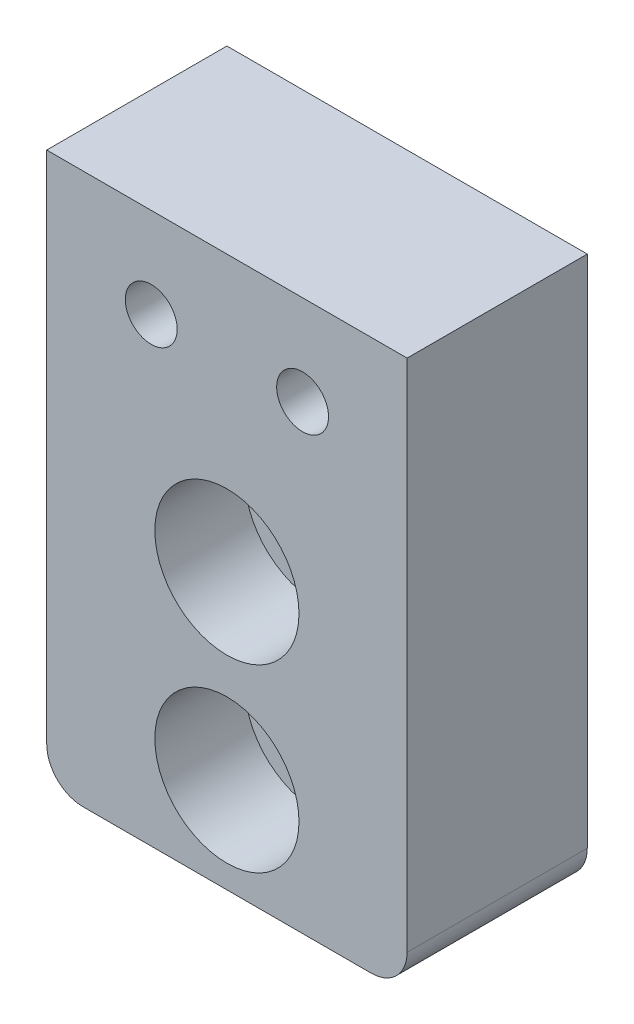
ISO-10303-21;
HEADER;
FILE_DESCRIPTION(('STEP AP214'),'2;1');
FILE_NAME('part.step','',(''),(''),'','','');
FILE_SCHEMA(('AUTOMOTIVE_DESIGN { 1 0 10303 214 1 1 1 1 }'));
ENDSEC;
DATA;
#1=APPLICATION_CONTEXT('core data for automotive mechanical design processes');
#2=APPLICATION_PROTOCOL_DEFINITION('international standard','automotive_design',2000,#1);
#3=PRODUCT_CONTEXT('',#1,'mechanical');
#4=PRODUCT('Part','Part','',(#3));
#5=PRODUCT_RELATED_PRODUCT_CATEGORY('part','',(#4));
#6=PRODUCT_DEFINITION_FORMATION('','',#4);
#7=PRODUCT_DEFINITION_CONTEXT('part definition',#1,'design');
#8=PRODUCT_DEFINITION('design','',#6,#7);
#9=PRODUCT_DEFINITION_SHAPE('','',#8);
#10=(LENGTH_UNIT() NAMED_UNIT(*) SI_UNIT(.MILLI.,.METRE.));
#11=(NAMED_UNIT(*) PLANE_ANGLE_UNIT() SI_UNIT($,.RADIAN.));
#12=(NAMED_UNIT(*) SI_UNIT($,.STERADIAN.) SOLID_ANGLE_UNIT());
#13=UNCERTAINTY_MEASURE_WITH_UNIT(LENGTH_MEASURE(1.E-05),#10,'distance_accuracy_value','');
#14=(GEOMETRIC_REPRESENTATION_CONTEXT(3) GLOBAL_UNCERTAINTY_ASSIGNED_CONTEXT((#13)) GLOBAL_UNIT_ASSIGNED_CONTEXT((#10,
#11,#12)) REPRESENTATION_CONTEXT('',''));
#15=CARTESIAN_POINT('',(0.,0.,0.));
#16=DIRECTION('',(0.,0.,1.));
#17=DIRECTION('',(1.,0.,0.));
#18=AXIS2_PLACEMENT_3D('',#15,#16,#17);
#19=CARTESIAN_POINT('',(0.,0.,12.7));
#20=DIRECTION('',(1.,0.,0.));
#21=DIRECTION('',(0.,0.,-1.));
#22=AXIS2_PLACEMENT_3D('',#19,#20,#21);
#23=PLANE('',#22);
#24=DIRECTION('',(0.,-1.,0.));
#25=VECTOR('',#24,1.);
#26=CARTESIAN_POINT('',(0.,0.,0.));
#27=LINE('',#26,#25);
#28=CARTESIAN_POINT('',(0.,38.8112,0.));
#29=VERTEX_POINT('',#28);
#30=CARTESIAN_POINT('',(0.,2.54,0.));
#31=VERTEX_POINT('',#30);
#32=EDGE_CURVE('E116',#29,#31,#27,.T.);
#33=ORIENTED_EDGE('',*,*,#32,.T.);
#34=DIRECTION('',(0.,0.,-1.));
#35=VECTOR('',#34,1.);
#36=CARTESIAN_POINT('',(0.,2.54,12.7));
#37=LINE('',#36,#35);
#38=CARTESIAN_POINT('',(0.,2.54,12.7));
#39=VERTEX_POINT('',#38);
#40=EDGE_CURVE('E11',#31,#39,#37,.F.);
#41=ORIENTED_EDGE('',*,*,#40,.T.);
#42=DIRECTION('',(0.,-1.,0.));
#43=VECTOR('',#42,1.);
#44=CARTESIAN_POINT('',(0.,0.,12.7));
#45=LINE('',#44,#43);
#46=CARTESIAN_POINT('',(0.,38.8112,12.7));
#47=VERTEX_POINT('',#46);
#48=EDGE_CURVE('E123',#47,#39,#45,.T.);
#49=ORIENTED_EDGE('',*,*,#48,.F.);
#50=DIRECTION('',(0.,0.,-1.));
#51=VECTOR('',#50,1.);
#52=CARTESIAN_POINT('',(0.,38.8112,12.7));
#53=LINE('',#52,#51);
#54=EDGE_CURVE('E108',#47,#29,#53,.T.);
#55=ORIENTED_EDGE('',*,*,#54,.T.);
#56=EDGE_LOOP('',(#33,#41,#49,#55));
#57=FACE_BOUND('',#56,.T.);
#58=ADVANCED_FACE('F34',(#57),#23,.F.);
#59=CARTESIAN_POINT('',(0.,0.,12.7));
#60=DIRECTION('',(0.,1.,0.));
#61=DIRECTION('',(0.,0.,1.));
#62=AXIS2_PLACEMENT_3D('',#59,#60,#61);
#63=PLANE('',#62);
#64=DIRECTION('',(1.,0.,0.));
#65=VECTOR('',#64,1.);
#66=CARTESIAN_POINT('',(0.,0.,0.));
#67=LINE('',#66,#65);
#68=CARTESIAN_POINT('',(2.54,0.,0.));
#69=VERTEX_POINT('',#68);
#70=CARTESIAN_POINT('',(22.86,0.,0.));
#71=VERTEX_POINT('',#70);
#72=EDGE_CURVE('E118',#69,#71,#67,.T.);
#73=ORIENTED_EDGE('',*,*,#72,.T.);
#74=DIRECTION('',(0.,0.,-1.));
#75=VECTOR('',#74,1.);
#76=CARTESIAN_POINT('',(22.86,0.,12.7));
#77=LINE('',#76,#75);
#78=CARTESIAN_POINT('',(22.86,0.,12.7));
#79=VERTEX_POINT('',#78);
#80=EDGE_CURVE('E55',#71,#79,#77,.F.);
#81=ORIENTED_EDGE('',*,*,#80,.T.);
#82=DIRECTION('',(1.,0.,0.));
#83=VECTOR('',#82,1.);
#84=CARTESIAN_POINT('',(0.,0.,12.7));
#85=LINE('',#84,#83);
#86=CARTESIAN_POINT('',(2.54,0.,12.7));
#87=VERTEX_POINT('',#86);
#88=EDGE_CURVE('E98',#87,#79,#85,.T.);
#89=ORIENTED_EDGE('',*,*,#88,.F.);
#90=DIRECTION('',(0.,0.,-1.));
#91=VECTOR('',#90,1.);
#92=CARTESIAN_POINT('',(2.54,0.,12.7));
#93=LINE('',#92,#91);
#94=EDGE_CURVE('E130',#87,#69,#93,.T.);
#95=ORIENTED_EDGE('',*,*,#94,.T.);
#96=EDGE_LOOP('',(#73,#81,#89,#95));
#97=FACE_BOUND('',#96,.T.);
#98=ADVANCED_FACE('F138',(#97),#63,.F.);
#99=CARTESIAN_POINT('',(25.4,0.,12.7));
#100=DIRECTION('',(-1.,0.,0.));
#101=DIRECTION('',(0.,0.,1.));
#102=AXIS2_PLACEMENT_3D('',#99,#100,#101);
#103=PLANE('',#102);
#104=DIRECTION('',(0.,1.,0.));
#105=VECTOR('',#104,1.);
#106=CARTESIAN_POINT('',(25.4,0.,12.7));
#107=LINE('',#106,#105);
#108=CARTESIAN_POINT('',(25.4,2.54,12.7));
#109=VERTEX_POINT('',#108);
#110=CARTESIAN_POINT('',(25.4,38.8112,12.7));
#111=VERTEX_POINT('',#110);
#112=EDGE_CURVE('E88',#109,#111,#107,.T.);
#113=ORIENTED_EDGE('',*,*,#112,.F.);
#114=DIRECTION('',(0.,0.,-1.));
#115=VECTOR('',#114,1.);
#116=CARTESIAN_POINT('',(25.4,2.54,12.7));
#117=LINE('',#116,#115);
#118=CARTESIAN_POINT('',(25.4,2.54,0.));
#119=VERTEX_POINT('',#118);
#120=EDGE_CURVE('E107',#109,#119,#117,.T.);
#121=ORIENTED_EDGE('',*,*,#120,.T.);
#122=DIRECTION('',(0.,1.,0.));
#123=VECTOR('',#122,1.);
#124=CARTESIAN_POINT('',(25.4,0.,0.));
#125=LINE('',#124,#123);
#126=CARTESIAN_POINT('',(25.4,38.8112,0.));
#127=VERTEX_POINT('',#126);
#128=EDGE_CURVE('E104',#119,#127,#125,.T.);
#129=ORIENTED_EDGE('',*,*,#128,.T.);
#130=DIRECTION('',(0.,0.,-1.));
#131=VECTOR('',#130,1.);
#132=CARTESIAN_POINT('',(25.4,38.8112,12.7));
#133=LINE('',#132,#131);
#134=EDGE_CURVE('E101',#111,#127,#133,.T.);
#135=ORIENTED_EDGE('',*,*,#134,.F.);
#136=EDGE_LOOP('',(#113,#121,#129,#135));
#137=FACE_BOUND('',#136,.T.);
#138=ADVANCED_FACE('F102',(#137),#103,.F.);
#139=CARTESIAN_POINT('',(0.,38.8112,12.7));
#140=DIRECTION('',(0.,-1.,0.));
#141=DIRECTION('',(0.,0.,-1.));
#142=AXIS2_PLACEMENT_3D('',#139,#140,#141);
#143=PLANE('',#142);
#144=DIRECTION('',(-1.,0.,0.));
#145=VECTOR('',#144,1.);
#146=CARTESIAN_POINT('',(0.,38.8112,0.));
#147=LINE('',#146,#145);
#148=EDGE_CURVE('E122',#127,#29,#147,.T.);
#149=ORIENTED_EDGE('',*,*,#148,.T.);
#150=ORIENTED_EDGE('',*,*,#54,.F.);
#151=DIRECTION('',(-1.,0.,0.));
#152=VECTOR('',#151,1.);
#153=CARTESIAN_POINT('',(0.,38.8112,12.7));
#154=LINE('',#153,#152);
#155=EDGE_CURVE('E92',#111,#47,#154,.T.);
#156=ORIENTED_EDGE('',*,*,#155,.F.);
#157=ORIENTED_EDGE('',*,*,#134,.T.);
#158=EDGE_LOOP('',(#149,#150,#156,#157));
#159=FACE_BOUND('',#158,.T.);
#160=ADVANCED_FACE('F110',(#159),#143,.F.);
#161=CARTESIAN_POINT('',(0.,0.,12.7));
#162=DIRECTION('',(0.,0.,-1.));
#163=DIRECTION('',(-1.,0.,0.));
#164=AXIS2_PLACEMENT_3D('',#161,#162,#163);
#165=PLANE('',#164);
#166=CARTESIAN_POINT('',(18.034,32.4612,12.7));
#167=DIRECTION('',(0.,0.,-1.));
#168=DIRECTION('',(-1.,0.,0.));
#169=AXIS2_PLACEMENT_3D('',#166,#167,#168);
#170=CIRCLE('',#169,1.8288);
#171=CARTESIAN_POINT('',(16.2052,32.4612,12.7));
#172=VERTEX_POINT('',#171);
#173=EDGE_CURVE('E180',#172,#172,#170,.T.);
#174=ORIENTED_EDGE('',*,*,#173,.T.);
#175=EDGE_LOOP('',(#174));
#176=FACE_BOUND('',#175,.T.);
#177=CARTESIAN_POINT('',(7.366,32.4612,12.7));
#178=DIRECTION('',(0.,0.,-1.));
#179=DIRECTION('',(-1.,0.,0.));
#180=AXIS2_PLACEMENT_3D('',#177,#178,#179);
#181=CIRCLE('',#180,1.8288);
#182=CARTESIAN_POINT('',(5.5372,32.4612,12.7));
#183=VERTEX_POINT('',#182);
#184=EDGE_CURVE('E168',#183,#183,#181,.T.);
#185=ORIENTED_EDGE('',*,*,#184,.T.);
#186=EDGE_LOOP('',(#185));
#187=FACE_BOUND('',#186,.T.);
#188=CARTESIAN_POINT('',(12.7,19.4056,12.7));
#189=DIRECTION('',(0.,0.,1.));
#190=DIRECTION('',(1.,0.,0.));
#191=AXIS2_PLACEMENT_3D('',#188,#189,#190);
#192=CIRCLE('',#191,5.08);
#193=CARTESIAN_POINT('',(17.78,19.4056,12.7));
#194=VERTEX_POINT('',#193);
#195=EDGE_CURVE('E165',#194,#194,#192,.T.);
#196=ORIENTED_EDGE('',*,*,#195,.F.);
#197=EDGE_LOOP('',(#196));
#198=FACE_BOUND('',#197,.T.);
#199=CARTESIAN_POINT('',(12.7,6.7056,12.7));
#200=DIRECTION('',(0.,0.,1.));
#201=DIRECTION('',(1.,0.,0.));
#202=AXIS2_PLACEMENT_3D('',#199,#200,#201);
#203=CIRCLE('',#202,5.08);
#204=CARTESIAN_POINT('',(17.78,6.7056,12.7));
#205=VERTEX_POINT('',#204);
#206=EDGE_CURVE('E153',#205,#205,#203,.T.);
#207=ORIENTED_EDGE('',*,*,#206,.F.);
#208=EDGE_LOOP('',(#207));
#209=FACE_BOUND('',#208,.T.);
#210=ORIENTED_EDGE('',*,*,#88,.T.);
#211=CARTESIAN_POINT('',(22.86,2.54,12.7));
#212=DIRECTION('',(0.,0.,-1.));
#213=DIRECTION('',(-1.,0.,0.));
#214=AXIS2_PLACEMENT_3D('',#211,#212,#213);
#215=CIRCLE('',#214,2.54);
#216=EDGE_CURVE('E42',#79,#109,#215,.F.);
#217=ORIENTED_EDGE('',*,*,#216,.T.);
#218=ORIENTED_EDGE('',*,*,#112,.T.);
#219=ORIENTED_EDGE('',*,*,#155,.T.);
#220=ORIENTED_EDGE('',*,*,#48,.T.);
#221=CARTESIAN_POINT('',(2.54,2.54,12.7));
#222=DIRECTION('',(0.,0.,-1.));
#223=DIRECTION('',(-1.,0.,0.));
#224=AXIS2_PLACEMENT_3D('',#221,#222,#223);
#225=CIRCLE('',#224,2.54);
#226=EDGE_CURVE('E134',#39,#87,#225,.F.);
#227=ORIENTED_EDGE('',*,*,#226,.T.);
#228=EDGE_LOOP('',(#210,#217,#218,#219,#220,#227));
#229=FACE_BOUND('',#228,.T.);
#230=ADVANCED_FACE('F90',(#176,#187,#198,#209,#229),#165,.F.);
#231=CARTESIAN_POINT('',(0.,0.,0.));
#232=DIRECTION('',(0.,0.,-1.));
#233=DIRECTION('',(-1.,0.,0.));
#234=AXIS2_PLACEMENT_3D('',#231,#232,#233);
#235=PLANE('',#234);
#236=CARTESIAN_POINT('',(18.034,32.4612,0.));
#237=DIRECTION('',(0.,0.,-1.));
#238=DIRECTION('',(-1.,0.,0.));
#239=AXIS2_PLACEMENT_3D('',#236,#237,#238);
#240=CIRCLE('',#239,3.048);
#241=CARTESIAN_POINT('',(14.986,32.4612,0.));
#242=VERTEX_POINT('',#241);
#243=EDGE_CURVE('E189',#242,#242,#240,.T.);
#244=ORIENTED_EDGE('',*,*,#243,.F.);
#245=EDGE_LOOP('',(#244));
#246=FACE_BOUND('',#245,.T.);
#247=CARTESIAN_POINT('',(7.366,32.4612,0.));
#248=DIRECTION('',(0.,0.,-1.));
#249=DIRECTION('',(-1.,0.,0.));
#250=AXIS2_PLACEMENT_3D('',#247,#248,#249);
#251=CIRCLE('',#250,3.048);
#252=CARTESIAN_POINT('',(4.318,32.4612,0.));
#253=VERTEX_POINT('',#252);
#254=EDGE_CURVE('E177',#253,#253,#251,.T.);
#255=ORIENTED_EDGE('',*,*,#254,.F.);
#256=EDGE_LOOP('',(#255));
#257=FACE_BOUND('',#256,.T.);
#258=CARTESIAN_POINT('',(12.7,19.4056,0.));
#259=DIRECTION('',(0.,0.,1.));
#260=DIRECTION('',(1.,0.,0.));
#261=AXIS2_PLACEMENT_3D('',#258,#259,#260);
#262=CIRCLE('',#261,3.2639);
#263=CARTESIAN_POINT('',(15.9639,19.4056,0.));
#264=VERTEX_POINT('',#263);
#265=EDGE_CURVE('E156',#264,#264,#262,.T.);
#266=ORIENTED_EDGE('',*,*,#265,.T.);
#267=EDGE_LOOP('',(#266));
#268=FACE_BOUND('',#267,.T.);
#269=CARTESIAN_POINT('',(12.7,6.7056,0.));
#270=DIRECTION('',(0.,0.,1.));
#271=DIRECTION('',(1.,0.,0.));
#272=AXIS2_PLACEMENT_3D('',#269,#270,#271);
#273=CIRCLE('',#272,3.2639);
#274=CARTESIAN_POINT('',(15.9639,6.7056,0.));
#275=VERTEX_POINT('',#274);
#276=EDGE_CURVE('E119',#275,#275,#273,.T.);
#277=ORIENTED_EDGE('',*,*,#276,.T.);
#278=EDGE_LOOP('',(#277));
#279=FACE_BOUND('',#278,.T.);
#280=ORIENTED_EDGE('',*,*,#128,.F.);
#281=CARTESIAN_POINT('',(22.86,2.54,0.));
#282=DIRECTION('',(0.,0.,-1.));
#283=DIRECTION('',(-1.,0.,0.));
#284=AXIS2_PLACEMENT_3D('',#281,#282,#283);
#285=CIRCLE('',#284,2.54);
#286=EDGE_CURVE('E128',#119,#71,#285,.T.);
#287=ORIENTED_EDGE('',*,*,#286,.T.);
#288=ORIENTED_EDGE('',*,*,#72,.F.);
#289=CARTESIAN_POINT('',(2.54,2.54,0.));
#290=DIRECTION('',(0.,0.,-1.));
#291=DIRECTION('',(-1.,0.,0.));
#292=AXIS2_PLACEMENT_3D('',#289,#290,#291);
#293=CIRCLE('',#292,2.54);
#294=EDGE_CURVE('E126',#69,#31,#293,.T.);
#295=ORIENTED_EDGE('',*,*,#294,.T.);
#296=ORIENTED_EDGE('',*,*,#32,.F.);
#297=ORIENTED_EDGE('',*,*,#148,.F.);
#298=EDGE_LOOP('',(#280,#287,#288,#295,#296,#297));
#299=FACE_BOUND('',#298,.T.);
#300=ADVANCED_FACE('F142',(#246,#257,#268,#279,#299),#235,.T.);
#301=CARTESIAN_POINT('',(12.7,6.7056,12.7));
#302=DIRECTION('',(0.,0.,1.));
#303=DIRECTION('',(1.,0.,0.));
#304=AXIS2_PLACEMENT_3D('',#301,#302,#303);
#305=CYLINDRICAL_SURFACE('',#304,3.2639);
#306=ORIENTED_EDGE('',*,*,#276,.F.);
#307=EDGE_LOOP('',(#306));
#308=FACE_BOUND('',#307,.T.);
#309=CARTESIAN_POINT('',(12.7,6.7056,6.35));
#310=DIRECTION('',(0.,0.,1.));
#311=DIRECTION('',(1.,0.,0.));
#312=AXIS2_PLACEMENT_3D('',#309,#310,#311);
#313=CIRCLE('',#312,3.2639);
#314=CARTESIAN_POINT('',(15.9639,6.7056,6.35));
#315=VERTEX_POINT('',#314);
#316=EDGE_CURVE('E147',#315,#315,#313,.T.);
#317=ORIENTED_EDGE('',*,*,#316,.T.);
#318=EDGE_LOOP('',(#317));
#319=FACE_BOUND('',#318,.T.);
#320=ADVANCED_FACE('F197',(#308,#319),#305,.F.);
#321=CARTESIAN_POINT('',(15.9639,6.7056,6.35));
#322=DIRECTION('',(0.,0.,-1.));
#323=DIRECTION('',(-1.,0.,0.));
#324=AXIS2_PLACEMENT_3D('',#321,#322,#323);
#325=PLANE('',#324);
#326=ORIENTED_EDGE('',*,*,#316,.F.);
#327=EDGE_LOOP('',(#326));
#328=FACE_BOUND('',#327,.T.);
#329=CARTESIAN_POINT('',(12.7,6.7056,6.35));
#330=DIRECTION('',(0.,0.,1.));
#331=DIRECTION('',(1.,0.,0.));
#332=AXIS2_PLACEMENT_3D('',#329,#330,#331);
#333=CIRCLE('',#332,5.08);
#334=CARTESIAN_POINT('',(17.78,6.7056,6.35));
#335=VERTEX_POINT('',#334);
#336=EDGE_CURVE('E150',#335,#335,#333,.T.);
#337=ORIENTED_EDGE('',*,*,#336,.T.);
#338=EDGE_LOOP('',(#337));
#339=FACE_BOUND('',#338,.T.);
#340=ADVANCED_FACE('F207',(#328,#339),#325,.F.);
#341=CARTESIAN_POINT('',(12.7,6.7056,12.7));
#342=DIRECTION('',(0.,0.,1.));
#343=DIRECTION('',(1.,0.,0.));
#344=AXIS2_PLACEMENT_3D('',#341,#342,#343);
#345=CYLINDRICAL_SURFACE('',#344,5.08);
#346=ORIENTED_EDGE('',*,*,#336,.F.);
#347=EDGE_LOOP('',(#346));
#348=FACE_BOUND('',#347,.T.);
#349=ORIENTED_EDGE('',*,*,#206,.T.);
#350=EDGE_LOOP('',(#349));
#351=FACE_BOUND('',#350,.T.);
#352=ADVANCED_FACE('F213',(#348,#351),#345,.F.);
#353=CARTESIAN_POINT('',(12.7,19.4056,12.7));
#354=DIRECTION('',(0.,0.,1.));
#355=DIRECTION('',(1.,0.,0.));
#356=AXIS2_PLACEMENT_3D('',#353,#354,#355);
#357=CYLINDRICAL_SURFACE('',#356,3.2639);
#358=ORIENTED_EDGE('',*,*,#265,.F.);
#359=EDGE_LOOP('',(#358));
#360=FACE_BOUND('',#359,.T.);
#361=CARTESIAN_POINT('',(12.7,19.4056,6.35));
#362=DIRECTION('',(0.,0.,1.));
#363=DIRECTION('',(1.,0.,0.));
#364=AXIS2_PLACEMENT_3D('',#361,#362,#363);
#365=CIRCLE('',#364,3.2639);
#366=CARTESIAN_POINT('',(15.9639,19.4056,6.35));
#367=VERTEX_POINT('',#366);
#368=EDGE_CURVE('E159',#367,#367,#365,.T.);
#369=ORIENTED_EDGE('',*,*,#368,.T.);
#370=EDGE_LOOP('',(#369));
#371=FACE_BOUND('',#370,.T.);
#372=ADVANCED_FACE('F219',(#360,#371),#357,.F.);
#373=CARTESIAN_POINT('',(15.9639,19.4056,6.35));
#374=DIRECTION('',(0.,0.,-1.));
#375=DIRECTION('',(-1.,0.,0.));
#376=AXIS2_PLACEMENT_3D('',#373,#374,#375);
#377=PLANE('',#376);
#378=ORIENTED_EDGE('',*,*,#368,.F.);
#379=EDGE_LOOP('',(#378));
#380=FACE_BOUND('',#379,.T.);
#381=CARTESIAN_POINT('',(12.7,19.4056,6.35));
#382=DIRECTION('',(0.,0.,1.));
#383=DIRECTION('',(1.,0.,0.));
#384=AXIS2_PLACEMENT_3D('',#381,#382,#383);
#385=CIRCLE('',#384,5.08);
#386=CARTESIAN_POINT('',(17.78,19.4056,6.35));
#387=VERTEX_POINT('',#386);
#388=EDGE_CURVE('E162',#387,#387,#385,.T.);
#389=ORIENTED_EDGE('',*,*,#388,.T.);
#390=EDGE_LOOP('',(#389));
#391=FACE_BOUND('',#390,.T.);
#392=ADVANCED_FACE('F248',(#380,#391),#377,.F.);
#393=CARTESIAN_POINT('',(12.7,19.4056,12.7));
#394=DIRECTION('',(0.,0.,1.));
#395=DIRECTION('',(1.,0.,0.));
#396=AXIS2_PLACEMENT_3D('',#393,#394,#395);
#397=CYLINDRICAL_SURFACE('',#396,5.08);
#398=ORIENTED_EDGE('',*,*,#388,.F.);
#399=EDGE_LOOP('',(#398));
#400=FACE_BOUND('',#399,.T.);
#401=ORIENTED_EDGE('',*,*,#195,.T.);
#402=EDGE_LOOP('',(#401));
#403=FACE_BOUND('',#402,.T.);
#404=ADVANCED_FACE('F241',(#400,#403),#397,.F.);
#405=CARTESIAN_POINT('',(22.86,2.54,12.7));
#406=DIRECTION('',(0.,0.,-1.));
#407=DIRECTION('',(-1.,0.,0.));
#408=AXIS2_PLACEMENT_3D('',#405,#406,#407);
#409=CYLINDRICAL_SURFACE('',#408,2.54);
#410=ORIENTED_EDGE('',*,*,#216,.F.);
#411=ORIENTED_EDGE('',*,*,#80,.F.);
#412=ORIENTED_EDGE('',*,*,#286,.F.);
#413=ORIENTED_EDGE('',*,*,#120,.F.);
#414=EDGE_LOOP('',(#410,#411,#412,#413));
#415=FACE_BOUND('',#414,.T.);
#416=ADVANCED_FACE('F239',(#415),#409,.T.);
#417=CARTESIAN_POINT('',(2.54,2.54,12.7));
#418=DIRECTION('',(0.,0.,-1.));
#419=DIRECTION('',(-1.,0.,0.));
#420=AXIS2_PLACEMENT_3D('',#417,#418,#419);
#421=CYLINDRICAL_SURFACE('',#420,2.54);
#422=ORIENTED_EDGE('',*,*,#226,.F.);
#423=ORIENTED_EDGE('',*,*,#40,.F.);
#424=ORIENTED_EDGE('',*,*,#294,.F.);
#425=ORIENTED_EDGE('',*,*,#94,.F.);
#426=EDGE_LOOP('',(#422,#423,#424,#425));
#427=FACE_BOUND('',#426,.T.);
#428=ADVANCED_FACE('F36',(#427),#421,.T.);
#429=CARTESIAN_POINT('',(7.366,32.4612,0.));
#430=DIRECTION('',(0.,0.,-1.));
#431=DIRECTION('',(-1.,0.,0.));
#432=AXIS2_PLACEMENT_3D('',#429,#430,#431);
#433=CYLINDRICAL_SURFACE('',#432,1.8288);
#434=ORIENTED_EDGE('',*,*,#184,.F.);
#435=EDGE_LOOP('',(#434));
#436=FACE_BOUND('',#435,.T.);
#437=CARTESIAN_POINT('',(7.366,32.4612,3.556));
#438=DIRECTION('',(0.,0.,-1.));
#439=DIRECTION('',(-1.,0.,0.));
#440=AXIS2_PLACEMENT_3D('',#437,#438,#439);
#441=CIRCLE('',#440,1.8288);
#442=CARTESIAN_POINT('',(5.5372,32.4612,3.556));
#443=VERTEX_POINT('',#442);
#444=EDGE_CURVE('E171',#443,#443,#441,.T.);
#445=ORIENTED_EDGE('',*,*,#444,.T.);
#446=EDGE_LOOP('',(#445));
#447=FACE_BOUND('',#446,.T.);
#448=ADVANCED_FACE('F247',(#436,#447),#433,.F.);
#449=CARTESIAN_POINT('',(9.1948,32.4612,3.556));
#450=DIRECTION('',(0.,0.,1.));
#451=DIRECTION('',(1.,0.,0.));
#452=AXIS2_PLACEMENT_3D('',#449,#450,#451);
#453=PLANE('',#452);
#454=ORIENTED_EDGE('',*,*,#444,.F.);
#455=EDGE_LOOP('',(#454));
#456=FACE_BOUND('',#455,.T.);
#457=CARTESIAN_POINT('',(7.366,32.4612,3.556));
#458=DIRECTION('',(0.,0.,-1.));
#459=DIRECTION('',(-1.,0.,0.));
#460=AXIS2_PLACEMENT_3D('',#457,#458,#459);
#461=CIRCLE('',#460,3.048);
#462=CARTESIAN_POINT('',(4.318,32.4612,3.556));
#463=VERTEX_POINT('',#462);
#464=EDGE_CURVE('E174',#463,#463,#461,.T.);
#465=ORIENTED_EDGE('',*,*,#464,.T.);
#466=EDGE_LOOP('',(#465));
#467=FACE_BOUND('',#466,.T.);
#468=ADVANCED_FACE('F296',(#456,#467),#453,.F.);
#469=CARTESIAN_POINT('',(7.366,32.4612,0.));
#470=DIRECTION('',(0.,0.,-1.));
#471=DIRECTION('',(-1.,0.,0.));
#472=AXIS2_PLACEMENT_3D('',#469,#470,#471);
#473=CYLINDRICAL_SURFACE('',#472,3.048);
#474=ORIENTED_EDGE('',*,*,#464,.F.);
#475=EDGE_LOOP('',(#474));
#476=FACE_BOUND('',#475,.T.);
#477=ORIENTED_EDGE('',*,*,#254,.T.);
#478=EDGE_LOOP('',(#477));
#479=FACE_BOUND('',#478,.T.);
#480=ADVANCED_FACE('F304',(#476,#479),#473,.F.);
#481=CARTESIAN_POINT('',(18.034,32.4612,0.));
#482=DIRECTION('',(0.,0.,-1.));
#483=DIRECTION('',(-1.,0.,0.));
#484=AXIS2_PLACEMENT_3D('',#481,#482,#483);
#485=CYLINDRICAL_SURFACE('',#484,1.8288);
#486=ORIENTED_EDGE('',*,*,#173,.F.);
#487=EDGE_LOOP('',(#486));
#488=FACE_BOUND('',#487,.T.);
#489=CARTESIAN_POINT('',(18.034,32.4612,3.556));
#490=DIRECTION('',(0.,0.,-1.));
#491=DIRECTION('',(-1.,0.,0.));
#492=AXIS2_PLACEMENT_3D('',#489,#490,#491);
#493=CIRCLE('',#492,1.8288);
#494=CARTESIAN_POINT('',(16.2052,32.4612,3.556));
#495=VERTEX_POINT('',#494);
#496=EDGE_CURVE('E183',#495,#495,#493,.T.);
#497=ORIENTED_EDGE('',*,*,#496,.T.);
#498=EDGE_LOOP('',(#497));
#499=FACE_BOUND('',#498,.T.);
#500=ADVANCED_FACE('F311',(#488,#499),#485,.F.);
#501=CARTESIAN_POINT('',(19.8628,32.4612,3.556));
#502=DIRECTION('',(0.,0.,1.));
#503=DIRECTION('',(1.,0.,0.));
#504=AXIS2_PLACEMENT_3D('',#501,#502,#503);
#505=PLANE('',#504);
#506=ORIENTED_EDGE('',*,*,#496,.F.);
#507=EDGE_LOOP('',(#506));
#508=FACE_BOUND('',#507,.T.);
#509=CARTESIAN_POINT('',(18.034,32.4612,3.556));
#510=DIRECTION('',(0.,0.,-1.));
#511=DIRECTION('',(-1.,0.,0.));
#512=AXIS2_PLACEMENT_3D('',#509,#510,#511);
#513=CIRCLE('',#512,3.048);
#514=CARTESIAN_POINT('',(14.986,32.4612,3.556));
#515=VERTEX_POINT('',#514);
#516=EDGE_CURVE('E186',#515,#515,#513,.T.);
#517=ORIENTED_EDGE('',*,*,#516,.T.);
#518=EDGE_LOOP('',(#517));
#519=FACE_BOUND('',#518,.T.);
#520=ADVANCED_FACE('F319',(#508,#519),#505,.F.);
#521=CARTESIAN_POINT('',(18.034,32.4612,0.));
#522=DIRECTION('',(0.,0.,-1.));
#523=DIRECTION('',(-1.,0.,0.));
#524=AXIS2_PLACEMENT_3D('',#521,#522,#523);
#525=CYLINDRICAL_SURFACE('',#524,3.048);
#526=ORIENTED_EDGE('',*,*,#516,.F.);
#527=EDGE_LOOP('',(#526));
#528=FACE_BOUND('',#527,.T.);
#529=ORIENTED_EDGE('',*,*,#243,.T.);
#530=EDGE_LOOP('',(#529));
#531=FACE_BOUND('',#530,.T.);
#532=ADVANCED_FACE('F193',(#528,#531),#525,.F.);
#533=CLOSED_SHELL('',(#58,#98,#138,#160,#230,#300,#320,#340,#352,#372,#392,#404,#416,#428,#448,
#468,#480,#500,#520,#532));
#534=MANIFOLD_SOLID_BREP('B2',#533);
#535=ADVANCED_BREP_SHAPE_REPRESENTATION('',(#18,#534),#14);
#536=SHAPE_DEFINITION_REPRESENTATION(#9,#535);
ENDSEC;
END-ISO-10303-21;
